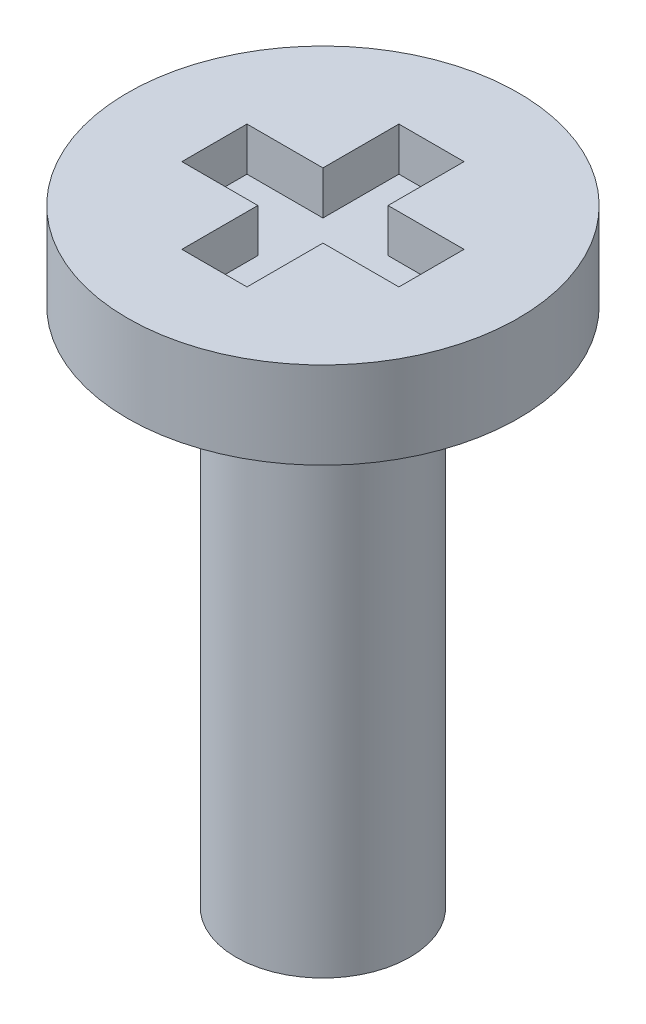
ISO-10303-21;
HEADER;
FILE_DESCRIPTION(('STEP AP214'),'2;1');
FILE_NAME('part.step','',(''),(''),'','','');
FILE_SCHEMA(('AUTOMOTIVE_DESIGN { 1 0 10303 214 1 1 1 1 }'));
ENDSEC;
DATA;
#1=APPLICATION_CONTEXT('core data for automotive mechanical design processes');
#2=APPLICATION_PROTOCOL_DEFINITION('international standard','automotive_design',2000,#1);
#3=PRODUCT_CONTEXT('',#1,'mechanical');
#4=PRODUCT('Part','Part','',(#3));
#5=PRODUCT_RELATED_PRODUCT_CATEGORY('part','',(#4));
#6=PRODUCT_DEFINITION_FORMATION('','',#4);
#7=PRODUCT_DEFINITION_CONTEXT('part definition',#1,'design');
#8=PRODUCT_DEFINITION('design','',#6,#7);
#9=PRODUCT_DEFINITION_SHAPE('','',#8);
#10=(LENGTH_UNIT() NAMED_UNIT(*) SI_UNIT(.MILLI.,.METRE.));
#11=(NAMED_UNIT(*) PLANE_ANGLE_UNIT() SI_UNIT($,.RADIAN.));
#12=(NAMED_UNIT(*) SI_UNIT($,.STERADIAN.) SOLID_ANGLE_UNIT());
#13=UNCERTAINTY_MEASURE_WITH_UNIT(LENGTH_MEASURE(1.E-05),#10,'distance_accuracy_value','');
#14=(GEOMETRIC_REPRESENTATION_CONTEXT(3) GLOBAL_UNCERTAINTY_ASSIGNED_CONTEXT((#13)) GLOBAL_UNIT_ASSIGNED_CONTEXT((#10,
#11,#12)) REPRESENTATION_CONTEXT('',''));
#15=CARTESIAN_POINT('',(0.,0.,0.));
#16=DIRECTION('',(0.,0.,1.));
#17=DIRECTION('',(1.,0.,0.));
#18=AXIS2_PLACEMENT_3D('',#15,#16,#17);
#19=CARTESIAN_POINT('',(-1.25,6.5,-0.375000000000001));
#20=DIRECTION('',(0.,0.,-1.));
#21=DIRECTION('',(-1.,0.,0.));
#22=AXIS2_PLACEMENT_3D('',#19,#20,#21);
#23=PLANE('',#22);
#24=DIRECTION('',(-1.,0.,0.));
#25=VECTOR('',#24,1.);
#26=CARTESIAN_POINT('',(-1.25,6.5,-0.375000000000001));
#27=LINE('',#26,#25);
#28=CARTESIAN_POINT('',(-0.375,6.5,-0.375000000000001));
#29=VERTEX_POINT('',#28);
#30=CARTESIAN_POINT('',(-1.25,6.5,-0.375000000000001));
#31=VERTEX_POINT('',#30);
#32=EDGE_CURVE('E186',#29,#31,#27,.T.);
#33=ORIENTED_EDGE('',*,*,#32,.F.);
#34=DIRECTION('',(0.,1.,0.));
#35=VECTOR('',#34,1.);
#36=CARTESIAN_POINT('',(-0.375,6.5,-0.375000000000001));
#37=LINE('',#36,#35);
#38=CARTESIAN_POINT('',(-0.375,7.,-0.375000000000001));
#39=VERTEX_POINT('',#38);
#40=EDGE_CURVE('E174',#29,#39,#37,.T.);
#41=ORIENTED_EDGE('',*,*,#40,.T.);
#42=DIRECTION('',(-1.,0.,0.));
#43=VECTOR('',#42,1.);
#44=CARTESIAN_POINT('',(-1.25,7.,-0.375000000000001));
#45=LINE('',#44,#43);
#46=CARTESIAN_POINT('',(-1.25,7.,-0.375000000000001));
#47=VERTEX_POINT('',#46);
#48=EDGE_CURVE('E198',#39,#47,#45,.T.);
#49=ORIENTED_EDGE('',*,*,#48,.T.);
#50=DIRECTION('',(0.,1.,0.));
#51=VECTOR('',#50,1.);
#52=CARTESIAN_POINT('',(-1.25,6.5,-0.375000000000001));
#53=LINE('',#52,#51);
#54=EDGE_CURVE('E201',#31,#47,#53,.T.);
#55=ORIENTED_EDGE('',*,*,#54,.F.);
#56=EDGE_LOOP('',(#33,#41,#49,#55));
#57=FACE_BOUND('',#56,.T.);
#58=ADVANCED_FACE('F33',(#57),#23,.F.);
#59=CARTESIAN_POINT('',(-1.25,6.5,0.374999999999999));
#60=DIRECTION('',(0.,0.,1.));
#61=DIRECTION('',(1.,0.,0.));
#62=AXIS2_PLACEMENT_3D('',#59,#60,#61);
#63=PLANE('',#62);
#64=DIRECTION('',(1.,0.,0.));
#65=VECTOR('',#64,1.);
#66=CARTESIAN_POINT('',(-1.25,7.,0.374999999999999));
#67=LINE('',#66,#65);
#68=CARTESIAN_POINT('',(-1.25,7.,0.374999999999999));
#69=VERTEX_POINT('',#68);
#70=CARTESIAN_POINT('',(-0.375,7.,0.374999999999999));
#71=VERTEX_POINT('',#70);
#72=EDGE_CURVE('E192',#69,#71,#67,.T.);
#73=ORIENTED_EDGE('',*,*,#72,.T.);
#74=DIRECTION('',(0.,-1.,0.));
#75=VECTOR('',#74,1.);
#76=CARTESIAN_POINT('',(-0.375,6.5,0.374999999999999));
#77=LINE('',#76,#75);
#78=CARTESIAN_POINT('',(-0.375,6.5,0.374999999999999));
#79=VERTEX_POINT('',#78);
#80=EDGE_CURVE('E172',#71,#79,#77,.T.);
#81=ORIENTED_EDGE('',*,*,#80,.T.);
#82=DIRECTION('',(1.,0.,0.));
#83=VECTOR('',#82,1.);
#84=CARTESIAN_POINT('',(-1.25,6.5,0.374999999999999));
#85=LINE('',#84,#83);
#86=CARTESIAN_POINT('',(-1.25,6.5,0.374999999999999));
#87=VERTEX_POINT('',#86);
#88=EDGE_CURVE('E129',#87,#79,#85,.T.);
#89=ORIENTED_EDGE('',*,*,#88,.F.);
#90=DIRECTION('',(0.,1.,0.));
#91=VECTOR('',#90,1.);
#92=CARTESIAN_POINT('',(-1.25,6.5,0.374999999999999));
#93=LINE('',#92,#91);
#94=EDGE_CURVE('E189',#87,#69,#93,.T.);
#95=ORIENTED_EDGE('',*,*,#94,.T.);
#96=EDGE_LOOP('',(#73,#81,#89,#95));
#97=FACE_BOUND('',#96,.T.);
#98=ADVANCED_FACE('F229',(#97),#63,.F.);
#99=CARTESIAN_POINT('',(0.,6.,0.));
#100=DIRECTION('',(0.,-1.,0.));
#101=DIRECTION('',(0.,0.,-1.));
#102=AXIS2_PLACEMENT_3D('',#99,#100,#101);
#103=CYLINDRICAL_SURFACE('',#102,1.);
#104=CARTESIAN_POINT('',(0.,6.,0.));
#105=DIRECTION('',(0.,1.,0.));
#106=DIRECTION('',(0.,0.,1.));
#107=AXIS2_PLACEMENT_3D('',#104,#105,#106);
#108=CIRCLE('',#107,1.);
#109=CARTESIAN_POINT('',(0.,6.,1.));
#110=VERTEX_POINT('',#109);
#111=EDGE_CURVE('E11',#110,#110,#108,.T.);
#112=ORIENTED_EDGE('',*,*,#111,.F.);
#113=EDGE_LOOP('',(#112));
#114=FACE_BOUND('',#113,.T.);
#115=CARTESIAN_POINT('',(0.,0.,0.));
#116=DIRECTION('',(0.,1.,0.));
#117=DIRECTION('',(0.,0.,1.));
#118=AXIS2_PLACEMENT_3D('',#115,#116,#117);
#119=CIRCLE('',#118,1.);
#120=CARTESIAN_POINT('',(0.,0.,1.));
#121=VERTEX_POINT('',#120);
#122=EDGE_CURVE('E37',#121,#121,#119,.T.);
#123=ORIENTED_EDGE('',*,*,#122,.T.);
#124=EDGE_LOOP('',(#123));
#125=FACE_BOUND('',#124,.T.);
#126=ADVANCED_FACE('F35',(#114,#125),#103,.T.);
#127=CARTESIAN_POINT('',(0.,0.,0.));
#128=DIRECTION('',(0.,1.,0.));
#129=DIRECTION('',(0.,0.,1.));
#130=AXIS2_PLACEMENT_3D('',#127,#128,#129);
#131=PLANE('',#130);
#132=ORIENTED_EDGE('',*,*,#122,.F.);
#133=EDGE_LOOP('',(#132));
#134=FACE_BOUND('',#133,.T.);
#135=ADVANCED_FACE('F223',(#134),#131,.F.);
#136=CARTESIAN_POINT('',(0.,6.,0.));
#137=DIRECTION('',(0.,1.,0.));
#138=DIRECTION('',(0.,0.,1.));
#139=AXIS2_PLACEMENT_3D('',#136,#137,#138);
#140=PLANE('',#139);
#141=CARTESIAN_POINT('',(0.,6.,0.));
#142=DIRECTION('',(0.,1.,0.));
#143=DIRECTION('',(0.,0.,1.));
#144=AXIS2_PLACEMENT_3D('',#141,#142,#143);
#145=CIRCLE('',#144,2.25);
#146=CARTESIAN_POINT('',(0.,6.,2.25));
#147=VERTEX_POINT('',#146);
#148=EDGE_CURVE('E204',#147,#147,#145,.T.);
#149=ORIENTED_EDGE('',*,*,#148,.F.);
#150=EDGE_LOOP('',(#149));
#151=FACE_BOUND('',#150,.T.);
#152=ORIENTED_EDGE('',*,*,#111,.T.);
#153=EDGE_LOOP('',(#152));
#154=FACE_BOUND('',#153,.T.);
#155=ADVANCED_FACE('F220',(#151,#154),#140,.F.);
#156=CARTESIAN_POINT('',(0.,7.,0.));
#157=DIRECTION('',(0.,-1.,0.));
#158=DIRECTION('',(0.,0.,-1.));
#159=AXIS2_PLACEMENT_3D('',#156,#157,#158);
#160=CYLINDRICAL_SURFACE('',#159,2.25);
#161=CARTESIAN_POINT('',(0.,7.,0.));
#162=DIRECTION('',(0.,1.,0.));
#163=DIRECTION('',(0.,0.,1.));
#164=AXIS2_PLACEMENT_3D('',#161,#162,#163);
#165=CIRCLE('',#164,2.25);
#166=CARTESIAN_POINT('',(0.,7.,2.25));
#167=VERTEX_POINT('',#166);
#168=EDGE_CURVE('E212',#167,#167,#165,.T.);
#169=ORIENTED_EDGE('',*,*,#168,.F.);
#170=EDGE_LOOP('',(#169));
#171=FACE_BOUND('',#170,.T.);
#172=ORIENTED_EDGE('',*,*,#148,.T.);
#173=EDGE_LOOP('',(#172));
#174=FACE_BOUND('',#173,.T.);
#175=ADVANCED_FACE('F218',(#171,#174),#160,.T.);
#176=CARTESIAN_POINT('',(0.,7.,0.));
#177=DIRECTION('',(0.,1.,0.));
#178=DIRECTION('',(0.,0.,1.));
#179=AXIS2_PLACEMENT_3D('',#176,#177,#178);
#180=PLANE('',#179);
#181=DIRECTION('',(0.,0.,1.));
#182=VECTOR('',#181,1.);
#183=CARTESIAN_POINT('',(-0.375,7.,-1.25));
#184=LINE('',#183,#182);
#185=CARTESIAN_POINT('',(-0.375,7.,-1.25));
#186=VERTEX_POINT('',#185);
#187=EDGE_CURVE('E151',#186,#39,#184,.T.);
#188=ORIENTED_EDGE('',*,*,#187,.F.);
#189=DIRECTION('',(-1.,0.,0.));
#190=VECTOR('',#189,1.);
#191=CARTESIAN_POINT('',(-0.375,7.,-1.25));
#192=LINE('',#191,#190);
#193=CARTESIAN_POINT('',(0.375,7.,-1.25));
#194=VERTEX_POINT('',#193);
#195=EDGE_CURVE('E132',#194,#186,#192,.T.);
#196=ORIENTED_EDGE('',*,*,#195,.F.);
#197=DIRECTION('',(0.,0.,-1.));
#198=VECTOR('',#197,1.);
#199=CARTESIAN_POINT('',(0.375,7.,-1.25));
#200=LINE('',#199,#198);
#201=CARTESIAN_POINT('',(0.375,7.,-0.375000000000001));
#202=VERTEX_POINT('',#201);
#203=EDGE_CURVE('E155',#202,#194,#200,.T.);
#204=ORIENTED_EDGE('',*,*,#203,.F.);
#205=CARTESIAN_POINT('',(1.25,7.,-0.375000000000001));
#206=VERTEX_POINT('',#205);
#207=EDGE_CURVE('E181',#206,#202,#45,.T.);
#208=ORIENTED_EDGE('',*,*,#207,.F.);
#209=DIRECTION('',(0.,0.,-1.));
#210=VECTOR('',#209,1.);
#211=CARTESIAN_POINT('',(1.25,7.,-0.375000000000001));
#212=LINE('',#211,#210);
#213=CARTESIAN_POINT('',(1.25,7.,0.374999999999999));
#214=VERTEX_POINT('',#213);
#215=EDGE_CURVE('E195',#214,#206,#212,.T.);
#216=ORIENTED_EDGE('',*,*,#215,.F.);
#217=CARTESIAN_POINT('',(0.375,7.,0.374999999999999));
#218=VERTEX_POINT('',#217);
#219=EDGE_CURVE('E191',#218,#214,#67,.T.);
#220=ORIENTED_EDGE('',*,*,#219,.F.);
#221=CARTESIAN_POINT('',(0.375,7.,1.25));
#222=VERTEX_POINT('',#221);
#223=EDGE_CURVE('E156',#222,#218,#200,.T.);
#224=ORIENTED_EDGE('',*,*,#223,.F.);
#225=DIRECTION('',(1.,0.,0.));
#226=VECTOR('',#225,1.);
#227=CARTESIAN_POINT('',(-0.375,7.,1.25));
#228=LINE('',#227,#226);
#229=CARTESIAN_POINT('',(-0.375,7.,1.25));
#230=VERTEX_POINT('',#229);
#231=EDGE_CURVE('E153',#230,#222,#228,.T.);
#232=ORIENTED_EDGE('',*,*,#231,.F.);
#233=EDGE_CURVE('E138',#71,#230,#184,.T.);
#234=ORIENTED_EDGE('',*,*,#233,.F.);
#235=ORIENTED_EDGE('',*,*,#72,.F.);
#236=DIRECTION('',(0.,0.,1.));
#237=VECTOR('',#236,1.);
#238=CARTESIAN_POINT('',(-1.25,7.,-0.375000000000001));
#239=LINE('',#238,#237);
#240=EDGE_CURVE('E177',#47,#69,#239,.T.);
#241=ORIENTED_EDGE('',*,*,#240,.F.);
#242=ORIENTED_EDGE('',*,*,#48,.F.);
#243=EDGE_LOOP('',(#188,#196,#204,#208,#216,#220,#224,#232,#234,#235,#241,#242));
#244=FACE_BOUND('',#243,.T.);
#245=ORIENTED_EDGE('',*,*,#168,.T.);
#246=EDGE_LOOP('',(#245));
#247=FACE_BOUND('',#246,.T.);
#248=ADVANCED_FACE('F259',(#244,#247),#180,.T.);
#249=CARTESIAN_POINT('',(-1.25,6.5,-0.375000000000001));
#250=DIRECTION('',(-1.,0.,0.));
#251=DIRECTION('',(0.,0.,1.));
#252=AXIS2_PLACEMENT_3D('',#249,#250,#251);
#253=PLANE('',#252);
#254=ORIENTED_EDGE('',*,*,#240,.T.);
#255=ORIENTED_EDGE('',*,*,#94,.F.);
#256=DIRECTION('',(0.,0.,1.));
#257=VECTOR('',#256,1.);
#258=CARTESIAN_POINT('',(-1.25,6.5,-0.375000000000001));
#259=LINE('',#258,#257);
#260=EDGE_CURVE('E178',#31,#87,#259,.T.);
#261=ORIENTED_EDGE('',*,*,#260,.F.);
#262=ORIENTED_EDGE('',*,*,#54,.T.);
#263=EDGE_LOOP('',(#254,#255,#261,#262));
#264=FACE_BOUND('',#263,.T.);
#265=ADVANCED_FACE('F252',(#264),#253,.F.);
#266=ORIENTED_EDGE('',*,*,#207,.T.);
#267=DIRECTION('',(0.,-1.,0.));
#268=VECTOR('',#267,1.);
#269=CARTESIAN_POINT('',(0.375,6.5,-0.375000000000001));
#270=LINE('',#269,#268);
#271=CARTESIAN_POINT('',(0.375,6.5,-0.375000000000001));
#272=VERTEX_POINT('',#271);
#273=EDGE_CURVE('E169',#202,#272,#270,.T.);
#274=ORIENTED_EDGE('',*,*,#273,.T.);
#275=CARTESIAN_POINT('',(1.25,6.5,-0.375000000000001));
#276=VERTEX_POINT('',#275);
#277=EDGE_CURVE('E187',#276,#272,#27,.T.);
#278=ORIENTED_EDGE('',*,*,#277,.F.);
#279=DIRECTION('',(0.,1.,0.));
#280=VECTOR('',#279,1.);
#281=CARTESIAN_POINT('',(1.25,6.5,-0.375000000000001));
#282=LINE('',#281,#280);
#283=EDGE_CURVE('E205',#276,#206,#282,.T.);
#284=ORIENTED_EDGE('',*,*,#283,.T.);
#285=EDGE_LOOP('',(#266,#274,#278,#284));
#286=FACE_BOUND('',#285,.T.);
#287=ADVANCED_FACE('F240',(#286),#23,.F.);
#288=CARTESIAN_POINT('',(1.25,6.5,-0.375000000000001));
#289=DIRECTION('',(1.,0.,0.));
#290=DIRECTION('',(0.,0.,-1.));
#291=AXIS2_PLACEMENT_3D('',#288,#289,#290);
#292=PLANE('',#291);
#293=ORIENTED_EDGE('',*,*,#215,.T.);
#294=ORIENTED_EDGE('',*,*,#283,.F.);
#295=DIRECTION('',(0.,0.,-1.));
#296=VECTOR('',#295,1.);
#297=CARTESIAN_POINT('',(1.25,6.5,-0.375000000000001));
#298=LINE('',#297,#296);
#299=CARTESIAN_POINT('',(1.25,6.5,0.374999999999999));
#300=VERTEX_POINT('',#299);
#301=EDGE_CURVE('E183',#300,#276,#298,.T.);
#302=ORIENTED_EDGE('',*,*,#301,.F.);
#303=DIRECTION('',(0.,1.,0.));
#304=VECTOR('',#303,1.);
#305=CARTESIAN_POINT('',(1.25,6.5,0.374999999999999));
#306=LINE('',#305,#304);
#307=EDGE_CURVE('E207',#300,#214,#306,.T.);
#308=ORIENTED_EDGE('',*,*,#307,.T.);
#309=EDGE_LOOP('',(#293,#294,#302,#308));
#310=FACE_BOUND('',#309,.T.);
#311=ADVANCED_FACE('F251',(#310),#292,.F.);
#312=CARTESIAN_POINT('',(0.375,6.5,0.374999999999999));
#313=VERTEX_POINT('',#312);
#314=EDGE_CURVE('E180',#313,#300,#85,.T.);
#315=ORIENTED_EDGE('',*,*,#314,.F.);
#316=DIRECTION('',(0.,1.,0.));
#317=VECTOR('',#316,1.);
#318=CARTESIAN_POINT('',(0.375,6.5,0.374999999999999));
#319=LINE('',#318,#317);
#320=EDGE_CURVE('E162',#313,#218,#319,.T.);
#321=ORIENTED_EDGE('',*,*,#320,.T.);
#322=ORIENTED_EDGE('',*,*,#219,.T.);
#323=ORIENTED_EDGE('',*,*,#307,.F.);
#324=EDGE_LOOP('',(#315,#321,#322,#323));
#325=FACE_BOUND('',#324,.T.);
#326=ADVANCED_FACE('F246',(#325),#63,.F.);
#327=CARTESIAN_POINT('',(-1.25,6.5,0.374999999999999));
#328=DIRECTION('',(0.,1.,0.));
#329=DIRECTION('',(0.,0.,1.));
#330=AXIS2_PLACEMENT_3D('',#327,#328,#329);
#331=PLANE('',#330);
#332=ORIENTED_EDGE('',*,*,#277,.T.);
#333=DIRECTION('',(0.,0.,-1.));
#334=VECTOR('',#333,1.);
#335=CARTESIAN_POINT('',(0.375,6.5,-1.25));
#336=LINE('',#335,#334);
#337=CARTESIAN_POINT('',(0.375,6.5,-1.25));
#338=VERTEX_POINT('',#337);
#339=EDGE_CURVE('E146',#272,#338,#336,.T.);
#340=ORIENTED_EDGE('',*,*,#339,.T.);
#341=DIRECTION('',(-1.,0.,0.));
#342=VECTOR('',#341,1.);
#343=CARTESIAN_POINT('',(-0.375,6.5,-1.25));
#344=LINE('',#343,#342);
#345=CARTESIAN_POINT('',(-0.375,6.5,-1.25));
#346=VERTEX_POINT('',#345);
#347=EDGE_CURVE('E143',#338,#346,#344,.T.);
#348=ORIENTED_EDGE('',*,*,#347,.T.);
#349=DIRECTION('',(0.,0.,1.));
#350=VECTOR('',#349,1.);
#351=CARTESIAN_POINT('',(-0.375,6.5,-1.25));
#352=LINE('',#351,#350);
#353=EDGE_CURVE('E48',#346,#29,#352,.T.);
#354=ORIENTED_EDGE('',*,*,#353,.T.);
#355=ORIENTED_EDGE('',*,*,#32,.T.);
#356=ORIENTED_EDGE('',*,*,#260,.T.);
#357=ORIENTED_EDGE('',*,*,#88,.T.);
#358=CARTESIAN_POINT('',(-0.375,6.5,1.25));
#359=VERTEX_POINT('',#358);
#360=EDGE_CURVE('E121',#79,#359,#352,.T.);
#361=ORIENTED_EDGE('',*,*,#360,.T.);
#362=DIRECTION('',(1.,0.,0.));
#363=VECTOR('',#362,1.);
#364=CARTESIAN_POINT('',(-0.375,6.5,1.25));
#365=LINE('',#364,#363);
#366=CARTESIAN_POINT('',(0.375,6.5,1.25));
#367=VERTEX_POINT('',#366);
#368=EDGE_CURVE('E126',#359,#367,#365,.T.);
#369=ORIENTED_EDGE('',*,*,#368,.T.);
#370=EDGE_CURVE('E55',#367,#313,#336,.T.);
#371=ORIENTED_EDGE('',*,*,#370,.T.);
#372=ORIENTED_EDGE('',*,*,#314,.T.);
#373=ORIENTED_EDGE('',*,*,#301,.T.);
#374=EDGE_LOOP('',(#332,#340,#348,#354,#355,#356,#357,#361,#369,#371,#372,#373));
#375=FACE_BOUND('',#374,.T.);
#376=ADVANCED_FACE('F124',(#375),#331,.T.);
#377=CARTESIAN_POINT('',(0.375,6.5,-1.25));
#378=DIRECTION('',(1.,0.,0.));
#379=DIRECTION('',(0.,0.,-1.));
#380=AXIS2_PLACEMENT_3D('',#377,#378,#379);
#381=PLANE('',#380);
#382=ORIENTED_EDGE('',*,*,#370,.F.);
#383=DIRECTION('',(0.,1.,0.));
#384=VECTOR('',#383,1.);
#385=CARTESIAN_POINT('',(0.375,6.5,1.25));
#386=LINE('',#385,#384);
#387=EDGE_CURVE('E142',#367,#222,#386,.T.);
#388=ORIENTED_EDGE('',*,*,#387,.T.);
#389=ORIENTED_EDGE('',*,*,#223,.T.);
#390=ORIENTED_EDGE('',*,*,#320,.F.);
#391=EDGE_LOOP('',(#382,#388,#389,#390));
#392=FACE_BOUND('',#391,.T.);
#393=ADVANCED_FACE('F283',(#392),#381,.F.);
#394=CARTESIAN_POINT('',(-0.375,6.5,-1.25));
#395=DIRECTION('',(-1.,0.,0.));
#396=DIRECTION('',(0.,0.,1.));
#397=AXIS2_PLACEMENT_3D('',#394,#395,#396);
#398=PLANE('',#397);
#399=ORIENTED_EDGE('',*,*,#233,.T.);
#400=DIRECTION('',(0.,1.,0.));
#401=VECTOR('',#400,1.);
#402=CARTESIAN_POINT('',(-0.375,6.5,1.25));
#403=LINE('',#402,#401);
#404=EDGE_CURVE('E135',#359,#230,#403,.T.);
#405=ORIENTED_EDGE('',*,*,#404,.F.);
#406=ORIENTED_EDGE('',*,*,#360,.F.);
#407=ORIENTED_EDGE('',*,*,#80,.F.);
#408=EDGE_LOOP('',(#399,#405,#406,#407));
#409=FACE_BOUND('',#408,.T.);
#410=ADVANCED_FACE('F136',(#409),#398,.F.);
#411=CARTESIAN_POINT('',(-0.375,6.5,1.25));
#412=DIRECTION('',(0.,0.,1.));
#413=DIRECTION('',(1.,0.,0.));
#414=AXIS2_PLACEMENT_3D('',#411,#412,#413);
#415=PLANE('',#414);
#416=ORIENTED_EDGE('',*,*,#231,.T.);
#417=ORIENTED_EDGE('',*,*,#387,.F.);
#418=ORIENTED_EDGE('',*,*,#368,.F.);
#419=ORIENTED_EDGE('',*,*,#404,.T.);
#420=EDGE_LOOP('',(#416,#417,#418,#419));
#421=FACE_BOUND('',#420,.T.);
#422=ADVANCED_FACE('F145',(#421),#415,.F.);
#423=ORIENTED_EDGE('',*,*,#353,.F.);
#424=DIRECTION('',(0.,1.,0.));
#425=VECTOR('',#424,1.);
#426=CARTESIAN_POINT('',(-0.375,6.5,-1.25));
#427=LINE('',#426,#425);
#428=EDGE_CURVE('E160',#346,#186,#427,.T.);
#429=ORIENTED_EDGE('',*,*,#428,.T.);
#430=ORIENTED_EDGE('',*,*,#187,.T.);
#431=ORIENTED_EDGE('',*,*,#40,.F.);
#432=EDGE_LOOP('',(#423,#429,#430,#431));
#433=FACE_BOUND('',#432,.T.);
#434=ADVANCED_FACE('F291',(#433),#398,.F.);
#435=ORIENTED_EDGE('',*,*,#203,.T.);
#436=DIRECTION('',(0.,1.,0.));
#437=VECTOR('',#436,1.);
#438=CARTESIAN_POINT('',(0.375,6.5,-1.25));
#439=LINE('',#438,#437);
#440=EDGE_CURVE('E163',#338,#194,#439,.T.);
#441=ORIENTED_EDGE('',*,*,#440,.F.);
#442=ORIENTED_EDGE('',*,*,#339,.F.);
#443=ORIENTED_EDGE('',*,*,#273,.F.);
#444=EDGE_LOOP('',(#435,#441,#442,#443));
#445=FACE_BOUND('',#444,.T.);
#446=ADVANCED_FACE('F273',(#445),#381,.F.);
#447=CARTESIAN_POINT('',(-0.375,6.5,-1.25));
#448=DIRECTION('',(0.,0.,-1.));
#449=DIRECTION('',(-1.,0.,0.));
#450=AXIS2_PLACEMENT_3D('',#447,#448,#449);
#451=PLANE('',#450);
#452=ORIENTED_EDGE('',*,*,#195,.T.);
#453=ORIENTED_EDGE('',*,*,#428,.F.);
#454=ORIENTED_EDGE('',*,*,#347,.F.);
#455=ORIENTED_EDGE('',*,*,#440,.T.);
#456=EDGE_LOOP('',(#452,#453,#454,#455));
#457=FACE_BOUND('',#456,.T.);
#458=ADVANCED_FACE('F276',(#457),#451,.F.);
#459=CLOSED_SHELL('',(#58,#98,#126,#135,#155,#175,#248,#265,#287,#311,#326,#376,#393,#410,#422,
#434,#446,#458));
#460=MANIFOLD_SOLID_BREP('B2',#459);
#461=ADVANCED_BREP_SHAPE_REPRESENTATION('',(#18,#460),#14);
#462=SHAPE_DEFINITION_REPRESENTATION(#9,#461);
ENDSEC;
END-ISO-10303-21;
